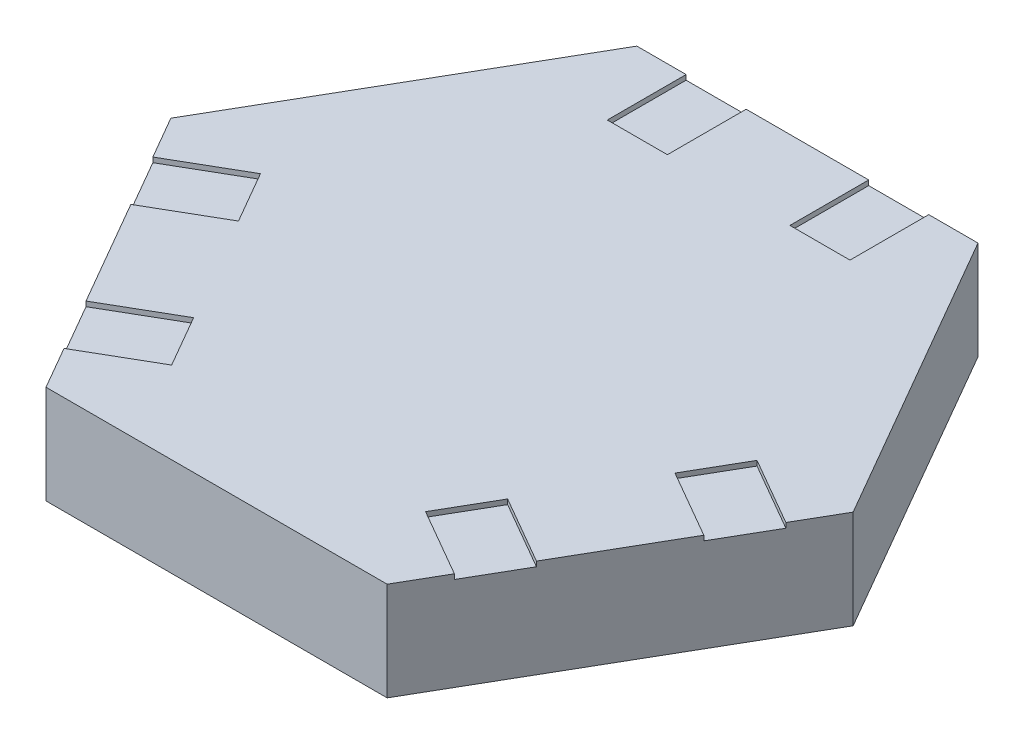
ISO-10303-21;
HEADER;
FILE_DESCRIPTION(('STEP AP214'),'2;1');
FILE_NAME('part.step','',(''),(''),'','','');
FILE_SCHEMA(('AUTOMOTIVE_DESIGN { 1 0 10303 214 1 1 1 1 }'));
ENDSEC;
DATA;
#1=APPLICATION_CONTEXT('core data for automotive mechanical design processes');
#2=APPLICATION_PROTOCOL_DEFINITION('international standard','automotive_design',2000,#1);
#3=PRODUCT_CONTEXT('',#1,'mechanical');
#4=PRODUCT('Part','Part','',(#3));
#5=PRODUCT_RELATED_PRODUCT_CATEGORY('part','',(#4));
#6=PRODUCT_DEFINITION_FORMATION('','',#4);
#7=PRODUCT_DEFINITION_CONTEXT('part definition',#1,'design');
#8=PRODUCT_DEFINITION('design','',#6,#7);
#9=PRODUCT_DEFINITION_SHAPE('','',#8);
#10=(LENGTH_UNIT() NAMED_UNIT(*) SI_UNIT(.MILLI.,.METRE.));
#11=(NAMED_UNIT(*) PLANE_ANGLE_UNIT() SI_UNIT($,.RADIAN.));
#12=(NAMED_UNIT(*) SI_UNIT($,.STERADIAN.) SOLID_ANGLE_UNIT());
#13=UNCERTAINTY_MEASURE_WITH_UNIT(LENGTH_MEASURE(1.E-05),#10,'distance_accuracy_value','');
#14=(GEOMETRIC_REPRESENTATION_CONTEXT(3) GLOBAL_UNCERTAINTY_ASSIGNED_CONTEXT((#13)) GLOBAL_UNIT_ASSIGNED_CONTEXT((#10,
#11,#12)) REPRESENTATION_CONTEXT('',''));
#15=CARTESIAN_POINT('',(0.,0.,0.));
#16=DIRECTION('',(0.,0.,1.));
#17=DIRECTION('',(1.,0.,0.));
#18=AXIS2_PLACEMENT_3D('',#15,#16,#17);
#19=CARTESIAN_POINT('',(34.6410161513775,20.,60.));
#20=DIRECTION('',(-0.866025403784439,0.,-0.5));
#21=DIRECTION('',(-0.5,0.,0.866025403784439));
#22=AXIS2_PLACEMENT_3D('',#19,#20,#21);
#23=PLANE('',#22);
#24=DIRECTION('',(0.5,0.,-0.866025403784439));
#25=VECTOR('',#24,1.);
#26=CARTESIAN_POINT('',(64.2820323027575,19.,8.66025403784195));
#27=LINE('',#26,#25);
#28=CARTESIAN_POINT('',(58.1820323027575,19.,19.2257639640121));
#29=VERTEX_POINT('',#28);
#30=CARTESIAN_POINT('',(64.2820323027575,19.,8.66025403784195));
#31=VERTEX_POINT('',#30);
#32=EDGE_CURVE('E314',#29,#31,#27,.T.);
#33=ORIENTED_EDGE('',*,*,#32,.F.);
#34=DIRECTION('',(0.,1.,0.));
#35=VECTOR('',#34,1.);
#36=CARTESIAN_POINT('',(58.1820323027575,19.,19.2257639640121));
#37=LINE('',#36,#35);
#38=CARTESIAN_POINT('',(58.1820323027575,20.,19.2257639640121));
#39=VERTEX_POINT('',#38);
#40=EDGE_CURVE('E295',#29,#39,#37,.T.);
#41=ORIENTED_EDGE('',*,*,#40,.T.);
#42=DIRECTION('',(0.5,0.,-0.866025403784439));
#43=VECTOR('',#42,1.);
#44=CARTESIAN_POINT('',(34.6410161513775,20.,60.));
#45=LINE('',#44,#43);
#46=CARTESIAN_POINT('',(45.7410161513792,20.,40.7742360359826));
#47=VERTEX_POINT('',#46);
#48=EDGE_CURVE('E476',#47,#39,#45,.T.);
#49=ORIENTED_EDGE('',*,*,#48,.F.);
#50=DIRECTION('',(0.,1.,0.));
#51=VECTOR('',#50,1.);
#52=CARTESIAN_POINT('',(45.74101615138,19.,40.774236035983));
#53=LINE('',#52,#51);
#54=CARTESIAN_POINT('',(45.74101615138,19.,40.774236035983));
#55=VERTEX_POINT('',#54);
#56=EDGE_CURVE('E371',#55,#47,#53,.T.);
#57=ORIENTED_EDGE('',*,*,#56,.F.);
#58=DIRECTION('',(0.499999999999999,0.,-0.866025403784439));
#59=VECTOR('',#58,1.);
#60=CARTESIAN_POINT('',(45.74101615138,19.,40.774236035983));
#61=LINE('',#60,#59);
#62=CARTESIAN_POINT('',(39.64101615138,19.,51.3397459621532));
#63=VERTEX_POINT('',#62);
#64=EDGE_CURVE('E354',#63,#55,#61,.T.);
#65=ORIENTED_EDGE('',*,*,#64,.F.);
#66=DIRECTION('',(0.,1.,0.));
#67=VECTOR('',#66,1.);
#68=CARTESIAN_POINT('',(39.64101615138,19.,51.3397459621532));
#69=LINE('',#68,#67);
#70=CARTESIAN_POINT('',(39.64101615138,20.,51.3397459621532));
#71=VERTEX_POINT('',#70);
#72=EDGE_CURVE('E337',#63,#71,#69,.T.);
#73=ORIENTED_EDGE('',*,*,#72,.T.);
#74=CARTESIAN_POINT('',(34.6410161513775,20.,60.));
#75=VERTEX_POINT('',#74);
#76=EDGE_CURVE('E471',#75,#71,#45,.T.);
#77=ORIENTED_EDGE('',*,*,#76,.F.);
#78=DIRECTION('',(0.,-1.,0.));
#79=VECTOR('',#78,1.);
#80=CARTESIAN_POINT('',(34.6410161513775,20.,60.));
#81=LINE('',#80,#79);
#82=CARTESIAN_POINT('',(34.6410161513775,0.,60.));
#83=VERTEX_POINT('',#82);
#84=EDGE_CURVE('E497',#75,#83,#81,.T.);
#85=ORIENTED_EDGE('',*,*,#84,.T.);
#86=DIRECTION('',(0.5,0.,-0.866025403784439));
#87=VECTOR('',#86,1.);
#88=CARTESIAN_POINT('',(34.6410161513775,0.,60.));
#89=LINE('',#88,#87);
#90=CARTESIAN_POINT('',(69.2820323027551,0.,0.));
#91=VERTEX_POINT('',#90);
#92=EDGE_CURVE('E462',#83,#91,#89,.T.);
#93=ORIENTED_EDGE('',*,*,#92,.T.);
#94=DIRECTION('',(0.,-1.,0.));
#95=VECTOR('',#94,1.);
#96=CARTESIAN_POINT('',(69.2820323027551,20.,0.));
#97=LINE('',#96,#95);
#98=CARTESIAN_POINT('',(69.2820323027551,20.,0.));
#99=VERTEX_POINT('',#98);
#100=EDGE_CURVE('E11',#99,#91,#97,.T.);
#101=ORIENTED_EDGE('',*,*,#100,.F.);
#102=CARTESIAN_POINT('',(64.2820323027567,20.,8.66025403784151));
#103=VERTEX_POINT('',#102);
#104=EDGE_CURVE('E477',#103,#99,#45,.T.);
#105=ORIENTED_EDGE('',*,*,#104,.F.);
#106=DIRECTION('',(0.,1.,0.));
#107=VECTOR('',#106,1.);
#108=CARTESIAN_POINT('',(64.2820323027575,19.,8.66025403784195));
#109=LINE('',#108,#107);
#110=EDGE_CURVE('E331',#31,#103,#109,.T.);
#111=ORIENTED_EDGE('',*,*,#110,.F.);
#112=EDGE_LOOP('',(#33,#41,#49,#57,#65,#73,#77,#85,#93,#101,#105,#111));
#113=FACE_BOUND('',#112,.T.);
#114=ADVANCED_FACE('F39',(#113),#23,.F.);
#115=CARTESIAN_POINT('',(69.2820323027551,20.,0.));
#116=DIRECTION('',(-0.866025403784439,0.,0.5));
#117=DIRECTION('',(0.5,0.,0.866025403784439));
#118=AXIS2_PLACEMENT_3D('',#115,#116,#117);
#119=PLANE('',#118);
#120=DIRECTION('',(-0.5,0.,-0.866025403784439));
#121=VECTOR('',#120,1.);
#122=CARTESIAN_POINT('',(69.2820323027551,0.,0.));
#123=LINE('',#122,#121);
#124=CARTESIAN_POINT('',(34.6410161513775,0.,-60.0000000000001));
#125=VERTEX_POINT('',#124);
#126=EDGE_CURVE('E501',#91,#125,#123,.T.);
#127=ORIENTED_EDGE('',*,*,#126,.T.);
#128=DIRECTION('',(0.,-1.,0.));
#129=VECTOR('',#128,1.);
#130=CARTESIAN_POINT('',(34.6410161513775,20.,-60.0000000000001));
#131=LINE('',#130,#129);
#132=CARTESIAN_POINT('',(34.6410161513775,20.,-60.0000000000001));
#133=VERTEX_POINT('',#132);
#134=EDGE_CURVE('E47',#133,#125,#131,.T.);
#135=ORIENTED_EDGE('',*,*,#134,.F.);
#136=DIRECTION('',(-0.5,0.,-0.866025403784439));
#137=VECTOR('',#136,1.);
#138=CARTESIAN_POINT('',(69.2820323027551,20.,0.));
#139=LINE('',#138,#137);
#140=EDGE_CURVE('E475',#99,#133,#139,.T.);
#141=ORIENTED_EDGE('',*,*,#140,.F.);
#142=ORIENTED_EDGE('',*,*,#100,.T.);
#143=EDGE_LOOP('',(#127,#135,#141,#142));
#144=FACE_BOUND('',#143,.T.);
#145=ADVANCED_FACE('F592',(#144),#119,.F.);
#146=CARTESIAN_POINT('',(34.6410161513775,20.,-60.0000000000001));
#147=DIRECTION('',(0.,0.,1.));
#148=DIRECTION('',(1.,0.,0.));
#149=AXIS2_PLACEMENT_3D('',#146,#147,#148);
#150=PLANE('',#149);
#151=DIRECTION('',(-1.,0.,0.));
#152=VECTOR('',#151,1.);
#153=CARTESIAN_POINT('',(12.4410161513775,19.,-60.0000000000001));
#154=LINE('',#153,#152);
#155=CARTESIAN_POINT('',(24.6410161513775,19.,-60.0000000000001));
#156=VERTEX_POINT('',#155);
#157=CARTESIAN_POINT('',(12.4410161513775,19.,-60.0000000000001));
#158=VERTEX_POINT('',#157);
#159=EDGE_CURVE('E272',#156,#158,#154,.T.);
#160=ORIENTED_EDGE('',*,*,#159,.F.);
#161=DIRECTION('',(0.,1.,0.));
#162=VECTOR('',#161,1.);
#163=CARTESIAN_POINT('',(24.6410161513775,19.,-60.0000000000001));
#164=LINE('',#163,#162);
#165=CARTESIAN_POINT('',(24.6410161513775,20.,-60.0000000000001));
#166=VERTEX_POINT('',#165);
#167=EDGE_CURVE('E301',#156,#166,#164,.T.);
#168=ORIENTED_EDGE('',*,*,#167,.T.);
#169=DIRECTION('',(-1.,0.,0.));
#170=VECTOR('',#169,1.);
#171=CARTESIAN_POINT('',(34.6410161513775,20.,-60.0000000000001));
#172=LINE('',#171,#170);
#173=EDGE_CURVE('E481',#133,#166,#172,.T.);
#174=ORIENTED_EDGE('',*,*,#173,.F.);
#175=ORIENTED_EDGE('',*,*,#134,.T.);
#176=DIRECTION('',(-1.,0.,0.));
#177=VECTOR('',#176,1.);
#178=CARTESIAN_POINT('',(34.6410161513775,0.,-60.0000000000001));
#179=LINE('',#178,#177);
#180=CARTESIAN_POINT('',(-34.6410161513776,0.,-60.0000000000001));
#181=VERTEX_POINT('',#180);
#182=EDGE_CURVE('E504',#125,#181,#179,.T.);
#183=ORIENTED_EDGE('',*,*,#182,.T.);
#184=DIRECTION('',(0.,-1.,0.));
#185=VECTOR('',#184,1.);
#186=CARTESIAN_POINT('',(-34.6410161513776,20.,-60.0000000000001));
#187=LINE('',#186,#185);
#188=CARTESIAN_POINT('',(-34.6410161513776,20.,-60.0000000000001));
#189=VERTEX_POINT('',#188);
#190=EDGE_CURVE('E527',#189,#181,#187,.T.);
#191=ORIENTED_EDGE('',*,*,#190,.F.);
#192=CARTESIAN_POINT('',(-24.6410161513776,20.,-60.0000000000001));
#193=VERTEX_POINT('',#192);
#194=EDGE_CURVE('E480',#193,#189,#172,.T.);
#195=ORIENTED_EDGE('',*,*,#194,.F.);
#196=DIRECTION('',(0.,1.,0.));
#197=VECTOR('',#196,1.);
#198=CARTESIAN_POINT('',(-24.6410161513776,19.,-60.));
#199=LINE('',#198,#197);
#200=CARTESIAN_POINT('',(-24.6410161513776,19.,-60.));
#201=VERTEX_POINT('',#200);
#202=EDGE_CURVE('E448',#201,#193,#199,.T.);
#203=ORIENTED_EDGE('',*,*,#202,.F.);
#204=DIRECTION('',(-1.,0.,0.));
#205=VECTOR('',#204,1.);
#206=CARTESIAN_POINT('',(-24.6410161513776,19.,-60.));
#207=LINE('',#206,#205);
#208=CARTESIAN_POINT('',(-12.4410161513776,19.,-60.0000000000001));
#209=VERTEX_POINT('',#208);
#210=EDGE_CURVE('E431',#209,#201,#207,.T.);
#211=ORIENTED_EDGE('',*,*,#210,.F.);
#212=DIRECTION('',(0.,1.,0.));
#213=VECTOR('',#212,1.);
#214=CARTESIAN_POINT('',(-12.4410161513776,19.,-60.0000000000001));
#215=LINE('',#214,#213);
#216=CARTESIAN_POINT('',(-12.4410161513776,20.,-60.0000000000001));
#217=VERTEX_POINT('',#216);
#218=EDGE_CURVE('E458',#209,#217,#215,.T.);
#219=ORIENTED_EDGE('',*,*,#218,.T.);
#220=CARTESIAN_POINT('',(12.4410161513775,20.,-60.0000000000001));
#221=VERTEX_POINT('',#220);
#222=EDGE_CURVE('E486',#221,#217,#172,.T.);
#223=ORIENTED_EDGE('',*,*,#222,.F.);
#224=DIRECTION('',(0.,1.,0.));
#225=VECTOR('',#224,1.);
#226=CARTESIAN_POINT('',(12.4410161513775,19.,-60.0000000000001));
#227=LINE('',#226,#225);
#228=EDGE_CURVE('E289',#158,#221,#227,.T.);
#229=ORIENTED_EDGE('',*,*,#228,.F.);
#230=EDGE_LOOP('',(#160,#168,#174,#175,#183,#191,#195,#203,#211,#219,#223,#229));
#231=FACE_BOUND('',#230,.T.);
#232=ADVANCED_FACE('F537',(#231),#150,.F.);
#233=CARTESIAN_POINT('',(-34.6410161513776,20.,-60.0000000000001));
#234=DIRECTION('',(0.866025403784439,0.,0.5));
#235=DIRECTION('',(0.5,0.,-0.866025403784439));
#236=AXIS2_PLACEMENT_3D('',#233,#234,#235);
#237=PLANE('',#236);
#238=DIRECTION('',(-0.5,0.,0.866025403784439));
#239=VECTOR('',#238,1.);
#240=CARTESIAN_POINT('',(-34.6410161513776,0.,-60.0000000000001));
#241=LINE('',#240,#239);
#242=CARTESIAN_POINT('',(-69.2820323027551,0.,0.));
#243=VERTEX_POINT('',#242);
#244=EDGE_CURVE('E507',#181,#243,#241,.T.);
#245=ORIENTED_EDGE('',*,*,#244,.T.);
#246=DIRECTION('',(0.,-1.,0.));
#247=VECTOR('',#246,1.);
#248=CARTESIAN_POINT('',(-69.2820323027551,20.,0.));
#249=LINE('',#248,#247);
#250=CARTESIAN_POINT('',(-69.2820323027551,20.,0.));
#251=VERTEX_POINT('',#250);
#252=EDGE_CURVE('E523',#251,#243,#249,.T.);
#253=ORIENTED_EDGE('',*,*,#252,.F.);
#254=DIRECTION('',(-0.5,0.,0.866025403784439));
#255=VECTOR('',#254,1.);
#256=CARTESIAN_POINT('',(-34.6410161513776,20.,-60.0000000000001));
#257=LINE('',#256,#255);
#258=EDGE_CURVE('E485',#189,#251,#257,.T.);
#259=ORIENTED_EDGE('',*,*,#258,.F.);
#260=ORIENTED_EDGE('',*,*,#190,.T.);
#261=EDGE_LOOP('',(#245,#253,#259,#260));
#262=FACE_BOUND('',#261,.T.);
#263=ADVANCED_FACE('F549',(#262),#237,.F.);
#264=CARTESIAN_POINT('',(-69.2820323027551,20.,0.));
#265=DIRECTION('',(0.866025403784439,0.,-0.5));
#266=DIRECTION('',(-0.5,0.,-0.866025403784439));
#267=AXIS2_PLACEMENT_3D('',#264,#265,#266);
#268=PLANE('',#267);
#269=DIRECTION('',(0.5,0.,0.866025403784438));
#270=VECTOR('',#269,1.);
#271=CARTESIAN_POINT('',(-45.7410161513743,19.,40.7742360359864));
#272=LINE('',#271,#270);
#273=CARTESIAN_POINT('',(-45.7410161513743,19.,40.7742360359864));
#274=VERTEX_POINT('',#273);
#275=CARTESIAN_POINT('',(-39.6410161513743,19.,51.3397459621565));
#276=VERTEX_POINT('',#275);
#277=EDGE_CURVE('E394',#274,#276,#272,.T.);
#278=ORIENTED_EDGE('',*,*,#277,.F.);
#279=DIRECTION('',(0.,1.,0.));
#280=VECTOR('',#279,1.);
#281=CARTESIAN_POINT('',(-45.7410161513743,19.,40.7742360359864));
#282=LINE('',#281,#280);
#283=CARTESIAN_POINT('',(-45.7410161513743,20.,40.7742360359864));
#284=VERTEX_POINT('',#283);
#285=EDGE_CURVE('E377',#274,#284,#282,.T.);
#286=ORIENTED_EDGE('',*,*,#285,.T.);
#287=DIRECTION('',(0.5,0.,0.866025403784439));
#288=VECTOR('',#287,1.);
#289=CARTESIAN_POINT('',(-69.2820323027551,20.,0.));
#290=LINE('',#289,#288);
#291=CARTESIAN_POINT('',(-58.1820323027539,20.,19.2257639640166));
#292=VERTEX_POINT('',#291);
#293=EDGE_CURVE('E262',#292,#284,#290,.T.);
#294=ORIENTED_EDGE('',*,*,#293,.F.);
#295=DIRECTION('',(0.,1.,0.));
#296=VECTOR('',#295,1.);
#297=CARTESIAN_POINT('',(-58.1820323027518,19.,19.2257639640155));
#298=LINE('',#297,#296);
#299=CARTESIAN_POINT('',(-58.1820323027518,19.,19.2257639640155));
#300=VERTEX_POINT('',#299);
#301=EDGE_CURVE('E62',#300,#292,#298,.T.);
#302=ORIENTED_EDGE('',*,*,#301,.F.);
#303=DIRECTION('',(0.499999999999999,0.,0.866025403784439));
#304=VECTOR('',#303,1.);
#305=CARTESIAN_POINT('',(-64.2820323027518,19.,8.66025403784531));
#306=LINE('',#305,#304);
#307=CARTESIAN_POINT('',(-64.2820323027518,19.,8.66025403784531));
#308=VERTEX_POINT('',#307);
#309=EDGE_CURVE('E245',#308,#300,#306,.T.);
#310=ORIENTED_EDGE('',*,*,#309,.F.);
#311=DIRECTION('',(0.,1.,0.));
#312=VECTOR('',#311,1.);
#313=CARTESIAN_POINT('',(-64.2820323027518,19.,8.66025403784531));
#314=LINE('',#313,#312);
#315=CARTESIAN_POINT('',(-64.2820323027518,20.,8.66025403784531));
#316=VERTEX_POINT('',#315);
#317=EDGE_CURVE('E415',#308,#316,#314,.T.);
#318=ORIENTED_EDGE('',*,*,#317,.T.);
#319=EDGE_CURVE('E490',#251,#316,#290,.T.);
#320=ORIENTED_EDGE('',*,*,#319,.F.);
#321=ORIENTED_EDGE('',*,*,#252,.T.);
#322=DIRECTION('',(0.5,0.,0.866025403784439));
#323=VECTOR('',#322,1.);
#324=CARTESIAN_POINT('',(-69.2820323027551,0.,0.));
#325=LINE('',#324,#323);
#326=CARTESIAN_POINT('',(-34.6410161513776,0.,60.));
#327=VERTEX_POINT('',#326);
#328=EDGE_CURVE('E510',#243,#327,#325,.T.);
#329=ORIENTED_EDGE('',*,*,#328,.T.);
#330=DIRECTION('',(0.,-1.,0.));
#331=VECTOR('',#330,1.);
#332=CARTESIAN_POINT('',(-34.6410161513776,20.,60.));
#333=LINE('',#332,#331);
#334=CARTESIAN_POINT('',(-34.6410161513776,20.,60.));
#335=VERTEX_POINT('',#334);
#336=EDGE_CURVE('E519',#335,#327,#333,.T.);
#337=ORIENTED_EDGE('',*,*,#336,.F.);
#338=CARTESIAN_POINT('',(-39.6410161513764,20.,51.3397459621577));
#339=VERTEX_POINT('',#338);
#340=EDGE_CURVE('E489',#339,#335,#290,.T.);
#341=ORIENTED_EDGE('',*,*,#340,.F.);
#342=DIRECTION('',(0.,1.,0.));
#343=VECTOR('',#342,1.);
#344=CARTESIAN_POINT('',(-39.6410161513743,19.,51.3397459621565));
#345=LINE('',#344,#343);
#346=EDGE_CURVE('E54',#276,#339,#345,.T.);
#347=ORIENTED_EDGE('',*,*,#346,.F.);
#348=EDGE_LOOP('',(#278,#286,#294,#302,#310,#318,#320,#321,#329,#337,#341,#347));
#349=FACE_BOUND('',#348,.T.);
#350=ADVANCED_FACE('F259',(#349),#268,.F.);
#351=CARTESIAN_POINT('',(-34.6410161513776,20.,60.));
#352=DIRECTION('',(0.,0.,-1.));
#353=DIRECTION('',(-1.,0.,0.));
#354=AXIS2_PLACEMENT_3D('',#351,#352,#353);
#355=PLANE('',#354);
#356=DIRECTION('',(1.,0.,0.));
#357=VECTOR('',#356,1.);
#358=CARTESIAN_POINT('',(-34.6410161513776,0.,60.));
#359=LINE('',#358,#357);
#360=EDGE_CURVE('E513',#327,#83,#359,.T.);
#361=ORIENTED_EDGE('',*,*,#360,.T.);
#362=ORIENTED_EDGE('',*,*,#84,.F.);
#363=DIRECTION('',(1.,0.,0.));
#364=VECTOR('',#363,1.);
#365=CARTESIAN_POINT('',(-34.6410161513776,20.,60.));
#366=LINE('',#365,#364);
#367=EDGE_CURVE('E494',#335,#75,#366,.T.);
#368=ORIENTED_EDGE('',*,*,#367,.F.);
#369=ORIENTED_EDGE('',*,*,#336,.T.);
#370=EDGE_LOOP('',(#361,#362,#368,#369));
#371=FACE_BOUND('',#370,.T.);
#372=ADVANCED_FACE('F620',(#371),#355,.F.);
#373=CARTESIAN_POINT('',(0.,20.,0.));
#374=DIRECTION('',(0.,1.,0.));
#375=DIRECTION('',(0.,0.,1.));
#376=AXIS2_PLACEMENT_3D('',#373,#374,#375);
#377=PLANE('',#376);
#378=DIRECTION('',(0.,0.,-1.));
#379=VECTOR('',#378,1.);
#380=CARTESIAN_POINT('',(24.6410161513775,20.,-44.));
#381=LINE('',#380,#379);
#382=CARTESIAN_POINT('',(24.6410161513775,20.,-44.));
#383=VERTEX_POINT('',#382);
#384=EDGE_CURVE('E277',#383,#166,#381,.T.);
#385=ORIENTED_EDGE('',*,*,#384,.F.);
#386=DIRECTION('',(1.,0.,0.));
#387=VECTOR('',#386,1.);
#388=CARTESIAN_POINT('',(12.4410161513775,20.,-44.));
#389=LINE('',#388,#387);
#390=CARTESIAN_POINT('',(12.4410161513775,20.,-44.));
#391=VERTEX_POINT('',#390);
#392=EDGE_CURVE('E294',#391,#383,#389,.T.);
#393=ORIENTED_EDGE('',*,*,#392,.F.);
#394=DIRECTION('',(0.,0.,1.));
#395=VECTOR('',#394,1.);
#396=CARTESIAN_POINT('',(12.4410161513775,20.,-60.0000000000001));
#397=LINE('',#396,#395);
#398=EDGE_CURVE('E290',#221,#391,#397,.T.);
#399=ORIENTED_EDGE('',*,*,#398,.F.);
#400=ORIENTED_EDGE('',*,*,#222,.T.);
#401=DIRECTION('',(0.,0.,-1.));
#402=VECTOR('',#401,1.);
#403=CARTESIAN_POINT('',(-12.4410161513776,20.,-44.));
#404=LINE('',#403,#402);
#405=CARTESIAN_POINT('',(-12.4410161513776,20.,-44.));
#406=VERTEX_POINT('',#405);
#407=EDGE_CURVE('E436',#406,#217,#404,.T.);
#408=ORIENTED_EDGE('',*,*,#407,.F.);
#409=DIRECTION('',(1.,0.,0.));
#410=VECTOR('',#409,1.);
#411=CARTESIAN_POINT('',(-24.6410161513776,20.,-44.));
#412=LINE('',#411,#410);
#413=CARTESIAN_POINT('',(-24.6410161513776,20.,-44.));
#414=VERTEX_POINT('',#413);
#415=EDGE_CURVE('E452',#414,#406,#412,.T.);
#416=ORIENTED_EDGE('',*,*,#415,.F.);
#417=DIRECTION('',(0.,0.,1.));
#418=VECTOR('',#417,1.);
#419=CARTESIAN_POINT('',(-24.6410161513776,20.,-60.));
#420=LINE('',#419,#418);
#421=EDGE_CURVE('E305',#193,#414,#420,.T.);
#422=ORIENTED_EDGE('',*,*,#421,.F.);
#423=ORIENTED_EDGE('',*,*,#194,.T.);
#424=ORIENTED_EDGE('',*,*,#258,.T.);
#425=ORIENTED_EDGE('',*,*,#319,.T.);
#426=DIRECTION('',(-0.866025403784438,0.,0.500000000000001));
#427=VECTOR('',#426,1.);
#428=CARTESIAN_POINT('',(-50.4256258422008,20.,0.660254037845296));
#429=LINE('',#428,#427);
#430=CARTESIAN_POINT('',(-50.4256258422008,20.,0.660254037845296));
#431=VERTEX_POINT('',#430);
#432=EDGE_CURVE('E255',#431,#316,#429,.T.);
#433=ORIENTED_EDGE('',*,*,#432,.F.);
#434=DIRECTION('',(-0.5,0.,-0.866025403784438));
#435=VECTOR('',#434,1.);
#436=CARTESIAN_POINT('',(-44.3256258422008,20.,11.2257639640154));
#437=LINE('',#436,#435);
#438=CARTESIAN_POINT('',(-44.3256258422008,20.,11.2257639640154));
#439=VERTEX_POINT('',#438);
#440=EDGE_CURVE('E629',#439,#431,#437,.T.);
#441=ORIENTED_EDGE('',*,*,#440,.F.);
#442=DIRECTION('',(0.866025403784438,0.,-0.500000000000001));
#443=VECTOR('',#442,1.);
#444=CARTESIAN_POINT('',(-58.1820323027518,20.,19.2257639640155));
#445=LINE('',#444,#443);
#446=EDGE_CURVE('E627',#292,#439,#445,.T.);
#447=ORIENTED_EDGE('',*,*,#446,.F.);
#448=ORIENTED_EDGE('',*,*,#293,.T.);
#449=DIRECTION('',(-0.866025403784438,0.,0.5));
#450=VECTOR('',#449,1.);
#451=CARTESIAN_POINT('',(-31.8846096908233,20.,32.7742360359864));
#452=LINE('',#451,#450);
#453=CARTESIAN_POINT('',(-31.8846096908233,20.,32.7742360359864));
#454=VERTEX_POINT('',#453);
#455=EDGE_CURVE('E399',#454,#284,#452,.T.);
#456=ORIENTED_EDGE('',*,*,#455,.F.);
#457=DIRECTION('',(-0.5,0.,-0.866025403784438));
#458=VECTOR('',#457,1.);
#459=CARTESIAN_POINT('',(-25.7846096908233,20.,43.3397459621565));
#460=LINE('',#459,#458);
#461=CARTESIAN_POINT('',(-25.7846096908233,20.,43.3397459621565));
#462=VERTEX_POINT('',#461);
#463=EDGE_CURVE('E414',#462,#454,#460,.T.);
#464=ORIENTED_EDGE('',*,*,#463,.F.);
#465=DIRECTION('',(0.866025403784438,0.,-0.5));
#466=VECTOR('',#465,1.);
#467=CARTESIAN_POINT('',(-39.6410161513743,20.,51.3397459621565));
#468=LINE('',#467,#466);
#469=EDGE_CURVE('E411',#339,#462,#468,.T.);
#470=ORIENTED_EDGE('',*,*,#469,.F.);
#471=ORIENTED_EDGE('',*,*,#340,.T.);
#472=ORIENTED_EDGE('',*,*,#367,.T.);
#473=ORIENTED_EDGE('',*,*,#76,.T.);
#474=DIRECTION('',(0.866025403784439,0.,0.5));
#475=VECTOR('',#474,1.);
#476=CARTESIAN_POINT('',(25.784609690829,20.,43.3397459621532));
#477=LINE('',#476,#475);
#478=CARTESIAN_POINT('',(25.784609690829,20.,43.3397459621532));
#479=VERTEX_POINT('',#478);
#480=EDGE_CURVE('E359',#479,#71,#477,.T.);
#481=ORIENTED_EDGE('',*,*,#480,.F.);
#482=DIRECTION('',(-0.5,0.,0.866025403784439));
#483=VECTOR('',#482,1.);
#484=CARTESIAN_POINT('',(31.884609690829,20.,32.7742360359831));
#485=LINE('',#484,#483);
#486=CARTESIAN_POINT('',(31.884609690829,20.,32.7742360359831));
#487=VERTEX_POINT('',#486);
#488=EDGE_CURVE('E376',#487,#479,#485,.T.);
#489=ORIENTED_EDGE('',*,*,#488,.F.);
#490=DIRECTION('',(-0.866025403784439,0.,-0.5));
#491=VECTOR('',#490,1.);
#492=CARTESIAN_POINT('',(45.74101615138,20.,40.774236035983));
#493=LINE('',#492,#491);
#494=EDGE_CURVE('E372',#47,#487,#493,.T.);
#495=ORIENTED_EDGE('',*,*,#494,.F.);
#496=ORIENTED_EDGE('',*,*,#48,.T.);
#497=DIRECTION('',(0.866025403784439,0.,0.5));
#498=VECTOR('',#497,1.);
#499=CARTESIAN_POINT('',(44.3256258422065,20.,11.2257639640121));
#500=LINE('',#499,#498);
#501=CARTESIAN_POINT('',(44.3256258422065,20.,11.2257639640121));
#502=VERTEX_POINT('',#501);
#503=EDGE_CURVE('E319',#502,#39,#500,.T.);
#504=ORIENTED_EDGE('',*,*,#503,.F.);
#505=DIRECTION('',(-0.5,0.,0.866025403784439));
#506=VECTOR('',#505,1.);
#507=CARTESIAN_POINT('',(50.4256258422065,20.,0.660254037841961));
#508=LINE('',#507,#506);
#509=CARTESIAN_POINT('',(50.4256258422065,20.,0.660254037841961));
#510=VERTEX_POINT('',#509);
#511=EDGE_CURVE('E336',#510,#502,#508,.T.);
#512=ORIENTED_EDGE('',*,*,#511,.F.);
#513=DIRECTION('',(-0.866025403784439,0.,-0.5));
#514=VECTOR('',#513,1.);
#515=CARTESIAN_POINT('',(64.2820323027575,20.,8.66025403784195));
#516=LINE('',#515,#514);
#517=EDGE_CURVE('E332',#103,#510,#516,.T.);
#518=ORIENTED_EDGE('',*,*,#517,.F.);
#519=ORIENTED_EDGE('',*,*,#104,.T.);
#520=ORIENTED_EDGE('',*,*,#140,.T.);
#521=ORIENTED_EDGE('',*,*,#173,.T.);
#522=EDGE_LOOP('',(#385,#393,#399,#400,#408,#416,#422,#423,#424,#425,#433,#441,#447,#448,#456,
#464,#470,#471,#472,#473,#481,#489,#495,#496,#504,#512,#518,#519,#520,#521));
#523=FACE_BOUND('',#522,.T.);
#524=ADVANCED_FACE('F556',(#523),#377,.T.);
#525=CARTESIAN_POINT('',(0.,0.,0.));
#526=DIRECTION('',(0.,1.,0.));
#527=DIRECTION('',(0.,0.,1.));
#528=AXIS2_PLACEMENT_3D('',#525,#526,#527);
#529=PLANE('',#528);
#530=ORIENTED_EDGE('',*,*,#92,.F.);
#531=ORIENTED_EDGE('',*,*,#360,.F.);
#532=ORIENTED_EDGE('',*,*,#328,.F.);
#533=ORIENTED_EDGE('',*,*,#244,.F.);
#534=ORIENTED_EDGE('',*,*,#182,.F.);
#535=ORIENTED_EDGE('',*,*,#126,.F.);
#536=EDGE_LOOP('',(#530,#531,#532,#533,#534,#535));
#537=FACE_BOUND('',#536,.T.);
#538=ADVANCED_FACE('F544',(#537),#529,.F.);
#539=CARTESIAN_POINT('',(-12.4410161513776,19.,-44.));
#540=DIRECTION('',(1.,0.,0.));
#541=DIRECTION('',(0.,0.,-1.));
#542=AXIS2_PLACEMENT_3D('',#539,#540,#541);
#543=PLANE('',#542);
#544=ORIENTED_EDGE('',*,*,#407,.T.);
#545=ORIENTED_EDGE('',*,*,#218,.F.);
#546=DIRECTION('',(0.,0.,-1.));
#547=VECTOR('',#546,1.);
#548=CARTESIAN_POINT('',(-12.4410161513776,19.,-44.));
#549=LINE('',#548,#547);
#550=CARTESIAN_POINT('',(-12.4410161513776,19.,-44.));
#551=VERTEX_POINT('',#550);
#552=EDGE_CURVE('E444',#551,#209,#549,.T.);
#553=ORIENTED_EDGE('',*,*,#552,.F.);
#554=DIRECTION('',(0.,1.,0.));
#555=VECTOR('',#554,1.);
#556=CARTESIAN_POINT('',(-12.4410161513776,19.,-44.));
#557=LINE('',#556,#555);
#558=EDGE_CURVE('E463',#551,#406,#557,.T.);
#559=ORIENTED_EDGE('',*,*,#558,.T.);
#560=EDGE_LOOP('',(#544,#545,#553,#559));
#561=FACE_BOUND('',#560,.T.);
#562=ADVANCED_FACE('F573',(#561),#543,.F.);
#563=CARTESIAN_POINT('',(-24.6410161513776,19.,-44.));
#564=DIRECTION('',(0.,0.,1.));
#565=DIRECTION('',(1.,0.,0.));
#566=AXIS2_PLACEMENT_3D('',#563,#564,#565);
#567=PLANE('',#566);
#568=ORIENTED_EDGE('',*,*,#415,.T.);
#569=ORIENTED_EDGE('',*,*,#558,.F.);
#570=DIRECTION('',(1.,0.,0.));
#571=VECTOR('',#570,1.);
#572=CARTESIAN_POINT('',(-24.6410161513776,19.,-44.));
#573=LINE('',#572,#571);
#574=CARTESIAN_POINT('',(-24.6410161513776,19.,-44.));
#575=VERTEX_POINT('',#574);
#576=EDGE_CURVE('E440',#575,#551,#573,.T.);
#577=ORIENTED_EDGE('',*,*,#576,.F.);
#578=DIRECTION('',(0.,1.,0.));
#579=VECTOR('',#578,1.);
#580=CARTESIAN_POINT('',(-24.6410161513776,19.,-44.));
#581=LINE('',#580,#579);
#582=EDGE_CURVE('E466',#575,#414,#581,.T.);
#583=ORIENTED_EDGE('',*,*,#582,.T.);
#584=EDGE_LOOP('',(#568,#569,#577,#583));
#585=FACE_BOUND('',#584,.T.);
#586=ADVANCED_FACE('F578',(#585),#567,.F.);
#587=CARTESIAN_POINT('',(-24.6410161513776,19.,-60.));
#588=DIRECTION('',(-1.,0.,0.));
#589=DIRECTION('',(0.,0.,1.));
#590=AXIS2_PLACEMENT_3D('',#587,#588,#589);
#591=PLANE('',#590);
#592=ORIENTED_EDGE('',*,*,#421,.T.);
#593=ORIENTED_EDGE('',*,*,#582,.F.);
#594=DIRECTION('',(0.,0.,1.));
#595=VECTOR('',#594,1.);
#596=CARTESIAN_POINT('',(-24.6410161513776,19.,-60.));
#597=LINE('',#596,#595);
#598=EDGE_CURVE('E435',#201,#575,#597,.T.);
#599=ORIENTED_EDGE('',*,*,#598,.F.);
#600=ORIENTED_EDGE('',*,*,#202,.T.);
#601=EDGE_LOOP('',(#592,#593,#599,#600));
#602=FACE_BOUND('',#601,.T.);
#603=ADVANCED_FACE('F580',(#602),#591,.F.);
#604=CARTESIAN_POINT('',(0.,19.,0.));
#605=DIRECTION('',(0.,1.,0.));
#606=DIRECTION('',(0.,0.,1.));
#607=AXIS2_PLACEMENT_3D('',#604,#605,#606);
#608=PLANE('',#607);
#609=ORIENTED_EDGE('',*,*,#210,.T.);
#610=ORIENTED_EDGE('',*,*,#598,.T.);
#611=ORIENTED_EDGE('',*,*,#576,.T.);
#612=ORIENTED_EDGE('',*,*,#552,.T.);
#613=EDGE_LOOP('',(#609,#610,#611,#612));
#614=FACE_BOUND('',#613,.T.);
#615=ADVANCED_FACE('F575',(#614),#608,.T.);
#616=CARTESIAN_POINT('',(-50.4256258422008,19.,0.660254037845296));
#617=DIRECTION('',(-0.500000000000001,0.,-0.866025403784438));
#618=DIRECTION('',(-0.866025403784438,0.,0.500000000000001));
#619=AXIS2_PLACEMENT_3D('',#616,#617,#618);
#620=PLANE('',#619);
#621=ORIENTED_EDGE('',*,*,#432,.T.);
#622=ORIENTED_EDGE('',*,*,#317,.F.);
#623=DIRECTION('',(-0.866025403784438,0.,0.500000000000001));
#624=VECTOR('',#623,1.);
#625=CARTESIAN_POINT('',(-50.4256258422008,19.,0.660254037845296));
#626=LINE('',#625,#624);
#627=CARTESIAN_POINT('',(-50.4256258422008,19.,0.660254037845296));
#628=VERTEX_POINT('',#627);
#629=EDGE_CURVE('E251',#628,#308,#626,.T.);
#630=ORIENTED_EDGE('',*,*,#629,.F.);
#631=DIRECTION('',(0.,1.,0.));
#632=VECTOR('',#631,1.);
#633=CARTESIAN_POINT('',(-50.4256258422008,19.,0.660254037845296));
#634=LINE('',#633,#632);
#635=EDGE_CURVE('E267',#628,#431,#634,.T.);
#636=ORIENTED_EDGE('',*,*,#635,.T.);
#637=EDGE_LOOP('',(#621,#622,#630,#636));
#638=FACE_BOUND('',#637,.T.);
#639=ADVANCED_FACE('F587',(#638),#620,.F.);
#640=CARTESIAN_POINT('',(-44.3256258422008,19.,11.2257639640154));
#641=DIRECTION('',(0.866025403784439,0.,-0.5));
#642=DIRECTION('',(-0.5,0.,-0.866025403784439));
#643=AXIS2_PLACEMENT_3D('',#640,#641,#642);
#644=PLANE('',#643);
#645=ORIENTED_EDGE('',*,*,#440,.T.);
#646=ORIENTED_EDGE('',*,*,#635,.F.);
#647=DIRECTION('',(-0.5,0.,-0.866025403784438));
#648=VECTOR('',#647,1.);
#649=CARTESIAN_POINT('',(-44.3256258422008,19.,11.2257639640154));
#650=LINE('',#649,#648);
#651=CARTESIAN_POINT('',(-44.3256258422008,19.,11.2257639640154));
#652=VERTEX_POINT('',#651);
#653=EDGE_CURVE('E244',#652,#628,#650,.T.);
#654=ORIENTED_EDGE('',*,*,#653,.F.);
#655=DIRECTION('',(0.,1.,0.));
#656=VECTOR('',#655,1.);
#657=CARTESIAN_POINT('',(-44.3256258422008,19.,11.2257639640154));
#658=LINE('',#657,#656);
#659=EDGE_CURVE('E239',#652,#439,#658,.T.);
#660=ORIENTED_EDGE('',*,*,#659,.T.);
#661=EDGE_LOOP('',(#645,#646,#654,#660));
#662=FACE_BOUND('',#661,.T.);
#663=ADVANCED_FACE('F642',(#662),#644,.F.);
#664=CARTESIAN_POINT('',(-58.1820323027518,19.,19.2257639640155));
#665=DIRECTION('',(0.500000000000001,0.,0.866025403784438));
#666=DIRECTION('',(0.866025403784438,0.,-0.500000000000001));
#667=AXIS2_PLACEMENT_3D('',#664,#665,#666);
#668=PLANE('',#667);
#669=ORIENTED_EDGE('',*,*,#446,.T.);
#670=ORIENTED_EDGE('',*,*,#659,.F.);
#671=DIRECTION('',(0.866025403784438,0.,-0.500000000000001));
#672=VECTOR('',#671,1.);
#673=CARTESIAN_POINT('',(-58.1820323027518,19.,19.2257639640155));
#674=LINE('',#673,#672);
#675=EDGE_CURVE('E236',#300,#652,#674,.T.);
#676=ORIENTED_EDGE('',*,*,#675,.F.);
#677=ORIENTED_EDGE('',*,*,#301,.T.);
#678=EDGE_LOOP('',(#669,#670,#676,#677));
#679=FACE_BOUND('',#678,.T.);
#680=ADVANCED_FACE('F238',(#679),#668,.F.);
#681=CARTESIAN_POINT('',(0.,19.,0.));
#682=DIRECTION('',(0.,1.,0.));
#683=DIRECTION('',(0.,0.,1.));
#684=AXIS2_PLACEMENT_3D('',#681,#682,#683);
#685=PLANE('',#684);
#686=ORIENTED_EDGE('',*,*,#309,.T.);
#687=ORIENTED_EDGE('',*,*,#675,.T.);
#688=ORIENTED_EDGE('',*,*,#653,.T.);
#689=ORIENTED_EDGE('',*,*,#629,.T.);
#690=EDGE_LOOP('',(#686,#687,#688,#689));
#691=FACE_BOUND('',#690,.T.);
#692=ADVANCED_FACE('F249',(#691),#685,.T.);
#693=CARTESIAN_POINT('',(-31.8846096908233,19.,32.7742360359864));
#694=DIRECTION('',(-0.5,0.,-0.866025403784438));
#695=DIRECTION('',(-0.866025403784438,0.,0.5));
#696=AXIS2_PLACEMENT_3D('',#693,#694,#695);
#697=PLANE('',#696);
#698=ORIENTED_EDGE('',*,*,#455,.T.);
#699=ORIENTED_EDGE('',*,*,#285,.F.);
#700=DIRECTION('',(-0.866025403784438,0.,0.5));
#701=VECTOR('',#700,1.);
#702=CARTESIAN_POINT('',(-31.8846096908233,19.,32.7742360359864));
#703=LINE('',#702,#701);
#704=CARTESIAN_POINT('',(-31.8846096908233,19.,32.7742360359864));
#705=VERTEX_POINT('',#704);
#706=EDGE_CURVE('E407',#705,#274,#703,.T.);
#707=ORIENTED_EDGE('',*,*,#706,.F.);
#708=DIRECTION('',(0.,1.,0.));
#709=VECTOR('',#708,1.);
#710=CARTESIAN_POINT('',(-31.8846096908233,19.,32.7742360359864));
#711=LINE('',#710,#709);
#712=EDGE_CURVE('E423',#705,#454,#711,.T.);
#713=ORIENTED_EDGE('',*,*,#712,.T.);
#714=EDGE_LOOP('',(#698,#699,#707,#713));
#715=FACE_BOUND('',#714,.T.);
#716=ADVANCED_FACE('F703',(#715),#697,.F.);
#717=CARTESIAN_POINT('',(-25.7846096908233,19.,43.3397459621565));
#718=DIRECTION('',(0.866025403784439,0.,-0.5));
#719=DIRECTION('',(-0.5,0.,-0.866025403784439));
#720=AXIS2_PLACEMENT_3D('',#717,#718,#719);
#721=PLANE('',#720);
#722=ORIENTED_EDGE('',*,*,#463,.T.);
#723=ORIENTED_EDGE('',*,*,#712,.F.);
#724=DIRECTION('',(-0.5,0.,-0.866025403784438));
#725=VECTOR('',#724,1.);
#726=CARTESIAN_POINT('',(-25.7846096908233,19.,43.3397459621565));
#727=LINE('',#726,#725);
#728=CARTESIAN_POINT('',(-25.7846096908233,19.,43.3397459621565));
#729=VERTEX_POINT('',#728);
#730=EDGE_CURVE('E403',#729,#705,#727,.T.);
#731=ORIENTED_EDGE('',*,*,#730,.F.);
#732=DIRECTION('',(0.,1.,0.));
#733=VECTOR('',#732,1.);
#734=CARTESIAN_POINT('',(-25.7846096908233,19.,43.3397459621565));
#735=LINE('',#734,#733);
#736=EDGE_CURVE('E426',#729,#462,#735,.T.);
#737=ORIENTED_EDGE('',*,*,#736,.T.);
#738=EDGE_LOOP('',(#722,#723,#731,#737));
#739=FACE_BOUND('',#738,.T.);
#740=ADVANCED_FACE('F706',(#739),#721,.F.);
#741=CARTESIAN_POINT('',(-39.6410161513743,19.,51.3397459621565));
#742=DIRECTION('',(0.5,0.,0.866025403784438));
#743=DIRECTION('',(0.866025403784438,0.,-0.5));
#744=AXIS2_PLACEMENT_3D('',#741,#742,#743);
#745=PLANE('',#744);
#746=ORIENTED_EDGE('',*,*,#469,.T.);
#747=ORIENTED_EDGE('',*,*,#736,.F.);
#748=DIRECTION('',(0.866025403784438,0.,-0.5));
#749=VECTOR('',#748,1.);
#750=CARTESIAN_POINT('',(-39.6410161513743,19.,51.3397459621565));
#751=LINE('',#750,#749);
#752=EDGE_CURVE('E398',#276,#729,#751,.T.);
#753=ORIENTED_EDGE('',*,*,#752,.F.);
#754=ORIENTED_EDGE('',*,*,#346,.T.);
#755=EDGE_LOOP('',(#746,#747,#753,#754));
#756=FACE_BOUND('',#755,.T.);
#757=ADVANCED_FACE('F701',(#756),#745,.F.);
#758=CARTESIAN_POINT('',(0.,19.,0.));
#759=DIRECTION('',(0.,1.,0.));
#760=DIRECTION('',(0.,0.,1.));
#761=AXIS2_PLACEMENT_3D('',#758,#759,#760);
#762=PLANE('',#761);
#763=ORIENTED_EDGE('',*,*,#277,.T.);
#764=ORIENTED_EDGE('',*,*,#752,.T.);
#765=ORIENTED_EDGE('',*,*,#730,.T.);
#766=ORIENTED_EDGE('',*,*,#706,.T.);
#767=EDGE_LOOP('',(#763,#764,#765,#766));
#768=FACE_BOUND('',#767,.T.);
#769=ADVANCED_FACE('F691',(#768),#762,.T.);
#770=CARTESIAN_POINT('',(25.784609690829,19.,43.3397459621532));
#771=DIRECTION('',(-0.5,0.,0.866025403784439));
#772=DIRECTION('',(0.866025403784439,0.,0.5));
#773=AXIS2_PLACEMENT_3D('',#770,#771,#772);
#774=PLANE('',#773);
#775=ORIENTED_EDGE('',*,*,#480,.T.);
#776=ORIENTED_EDGE('',*,*,#72,.F.);
#777=DIRECTION('',(0.866025403784439,0.,0.5));
#778=VECTOR('',#777,1.);
#779=CARTESIAN_POINT('',(25.784609690829,19.,43.3397459621532));
#780=LINE('',#779,#778);
#781=CARTESIAN_POINT('',(25.784609690829,19.,43.3397459621532));
#782=VERTEX_POINT('',#781);
#783=EDGE_CURVE('E367',#782,#63,#780,.T.);
#784=ORIENTED_EDGE('',*,*,#783,.F.);
#785=DIRECTION('',(0.,1.,0.));
#786=VECTOR('',#785,1.);
#787=CARTESIAN_POINT('',(25.784609690829,19.,43.3397459621532));
#788=LINE('',#787,#786);
#789=EDGE_CURVE('E386',#782,#479,#788,.T.);
#790=ORIENTED_EDGE('',*,*,#789,.T.);
#791=EDGE_LOOP('',(#775,#776,#784,#790));
#792=FACE_BOUND('',#791,.T.);
#793=ADVANCED_FACE('F687',(#792),#774,.F.);
#794=CARTESIAN_POINT('',(31.884609690829,19.,32.7742360359831));
#795=DIRECTION('',(-0.866025403784439,0.,-0.5));
#796=DIRECTION('',(-0.5,0.,0.866025403784439));
#797=AXIS2_PLACEMENT_3D('',#794,#795,#796);
#798=PLANE('',#797);
#799=ORIENTED_EDGE('',*,*,#488,.T.);
#800=ORIENTED_EDGE('',*,*,#789,.F.);
#801=DIRECTION('',(-0.5,0.,0.866025403784439));
#802=VECTOR('',#801,1.);
#803=CARTESIAN_POINT('',(31.884609690829,19.,32.7742360359831));
#804=LINE('',#803,#802);
#805=CARTESIAN_POINT('',(31.884609690829,19.,32.7742360359831));
#806=VERTEX_POINT('',#805);
#807=EDGE_CURVE('E363',#806,#782,#804,.T.);
#808=ORIENTED_EDGE('',*,*,#807,.F.);
#809=DIRECTION('',(0.,1.,0.));
#810=VECTOR('',#809,1.);
#811=CARTESIAN_POINT('',(31.884609690829,19.,32.7742360359831));
#812=LINE('',#811,#810);
#813=EDGE_CURVE('E389',#806,#487,#812,.T.);
#814=ORIENTED_EDGE('',*,*,#813,.T.);
#815=EDGE_LOOP('',(#799,#800,#808,#814));
#816=FACE_BOUND('',#815,.T.);
#817=ADVANCED_FACE('F690',(#816),#798,.F.);
#818=CARTESIAN_POINT('',(45.74101615138,19.,40.774236035983));
#819=DIRECTION('',(0.5,0.,-0.866025403784439));
#820=DIRECTION('',(-0.866025403784439,0.,-0.5));
#821=AXIS2_PLACEMENT_3D('',#818,#819,#820);
#822=PLANE('',#821);
#823=ORIENTED_EDGE('',*,*,#494,.T.);
#824=ORIENTED_EDGE('',*,*,#813,.F.);
#825=DIRECTION('',(-0.866025403784439,0.,-0.5));
#826=VECTOR('',#825,1.);
#827=CARTESIAN_POINT('',(45.74101615138,19.,40.774236035983));
#828=LINE('',#827,#826);
#829=EDGE_CURVE('E358',#55,#806,#828,.T.);
#830=ORIENTED_EDGE('',*,*,#829,.F.);
#831=ORIENTED_EDGE('',*,*,#56,.T.);
#832=EDGE_LOOP('',(#823,#824,#830,#831));
#833=FACE_BOUND('',#832,.T.);
#834=ADVANCED_FACE('F685',(#833),#822,.F.);
#835=CARTESIAN_POINT('',(0.,19.,0.));
#836=DIRECTION('',(0.,1.,0.));
#837=DIRECTION('',(0.,0.,1.));
#838=AXIS2_PLACEMENT_3D('',#835,#836,#837);
#839=PLANE('',#838);
#840=ORIENTED_EDGE('',*,*,#64,.T.);
#841=ORIENTED_EDGE('',*,*,#829,.T.);
#842=ORIENTED_EDGE('',*,*,#807,.T.);
#843=ORIENTED_EDGE('',*,*,#783,.T.);
#844=EDGE_LOOP('',(#840,#841,#842,#843));
#845=FACE_BOUND('',#844,.T.);
#846=ADVANCED_FACE('F676',(#845),#839,.T.);
#847=CARTESIAN_POINT('',(44.3256258422065,19.,11.2257639640121));
#848=DIRECTION('',(-0.5,0.,0.866025403784439));
#849=DIRECTION('',(0.866025403784439,0.,0.5));
#850=AXIS2_PLACEMENT_3D('',#847,#848,#849);
#851=PLANE('',#850);
#852=ORIENTED_EDGE('',*,*,#503,.T.);
#853=ORIENTED_EDGE('',*,*,#40,.F.);
#854=DIRECTION('',(0.866025403784439,0.,0.5));
#855=VECTOR('',#854,1.);
#856=CARTESIAN_POINT('',(44.3256258422065,19.,11.2257639640121));
#857=LINE('',#856,#855);
#858=CARTESIAN_POINT('',(44.3256258422065,19.,11.2257639640121));
#859=VERTEX_POINT('',#858);
#860=EDGE_CURVE('E327',#859,#29,#857,.T.);
#861=ORIENTED_EDGE('',*,*,#860,.F.);
#862=DIRECTION('',(0.,1.,0.));
#863=VECTOR('',#862,1.);
#864=CARTESIAN_POINT('',(44.3256258422065,19.,11.2257639640121));
#865=LINE('',#864,#863);
#866=EDGE_CURVE('E346',#859,#502,#865,.T.);
#867=ORIENTED_EDGE('',*,*,#866,.T.);
#868=EDGE_LOOP('',(#852,#853,#861,#867));
#869=FACE_BOUND('',#868,.T.);
#870=ADVANCED_FACE('F607',(#869),#851,.F.);
#871=CARTESIAN_POINT('',(50.4256258422065,19.,0.660254037841961));
#872=DIRECTION('',(-0.866025403784439,0.,-0.5));
#873=DIRECTION('',(-0.5,0.,0.866025403784439));
#874=AXIS2_PLACEMENT_3D('',#871,#872,#873);
#875=PLANE('',#874);
#876=ORIENTED_EDGE('',*,*,#511,.T.);
#877=ORIENTED_EDGE('',*,*,#866,.F.);
#878=DIRECTION('',(-0.5,0.,0.866025403784439));
#879=VECTOR('',#878,1.);
#880=CARTESIAN_POINT('',(50.4256258422065,19.,0.660254037841961));
#881=LINE('',#880,#879);
#882=CARTESIAN_POINT('',(50.4256258422065,19.,0.660254037841961));
#883=VERTEX_POINT('',#882);
#884=EDGE_CURVE('E323',#883,#859,#881,.T.);
#885=ORIENTED_EDGE('',*,*,#884,.F.);
#886=DIRECTION('',(0.,1.,0.));
#887=VECTOR('',#886,1.);
#888=CARTESIAN_POINT('',(50.4256258422065,19.,0.660254037841961));
#889=LINE('',#888,#887);
#890=EDGE_CURVE('E349',#883,#510,#889,.T.);
#891=ORIENTED_EDGE('',*,*,#890,.T.);
#892=EDGE_LOOP('',(#876,#877,#885,#891));
#893=FACE_BOUND('',#892,.T.);
#894=ADVANCED_FACE('F675',(#893),#875,.F.);
#895=CARTESIAN_POINT('',(64.2820323027575,19.,8.66025403784195));
#896=DIRECTION('',(0.5,0.,-0.866025403784439));
#897=DIRECTION('',(-0.866025403784439,0.,-0.5));
#898=AXIS2_PLACEMENT_3D('',#895,#896,#897);
#899=PLANE('',#898);
#900=ORIENTED_EDGE('',*,*,#517,.T.);
#901=ORIENTED_EDGE('',*,*,#890,.F.);
#902=DIRECTION('',(-0.866025403784439,0.,-0.5));
#903=VECTOR('',#902,1.);
#904=CARTESIAN_POINT('',(64.2820323027575,19.,8.66025403784195));
#905=LINE('',#904,#903);
#906=EDGE_CURVE('E318',#31,#883,#905,.T.);
#907=ORIENTED_EDGE('',*,*,#906,.F.);
#908=ORIENTED_EDGE('',*,*,#110,.T.);
#909=EDGE_LOOP('',(#900,#901,#907,#908));
#910=FACE_BOUND('',#909,.T.);
#911=ADVANCED_FACE('F672',(#910),#899,.F.);
#912=CARTESIAN_POINT('',(0.,19.,0.));
#913=DIRECTION('',(0.,1.,0.));
#914=DIRECTION('',(0.,0.,1.));
#915=AXIS2_PLACEMENT_3D('',#912,#913,#914);
#916=PLANE('',#915);
#917=ORIENTED_EDGE('',*,*,#32,.T.);
#918=ORIENTED_EDGE('',*,*,#906,.T.);
#919=ORIENTED_EDGE('',*,*,#884,.T.);
#920=ORIENTED_EDGE('',*,*,#860,.T.);
#921=EDGE_LOOP('',(#917,#918,#919,#920));
#922=FACE_BOUND('',#921,.T.);
#923=ADVANCED_FACE('F603',(#922),#916,.T.);
#924=CARTESIAN_POINT('',(24.6410161513775,19.,-44.));
#925=DIRECTION('',(1.,0.,0.));
#926=DIRECTION('',(0.,0.,-1.));
#927=AXIS2_PLACEMENT_3D('',#924,#925,#926);
#928=PLANE('',#927);
#929=ORIENTED_EDGE('',*,*,#384,.T.);
#930=ORIENTED_EDGE('',*,*,#167,.F.);
#931=DIRECTION('',(0.,0.,-1.));
#932=VECTOR('',#931,1.);
#933=CARTESIAN_POINT('',(24.6410161513775,19.,-44.));
#934=LINE('',#933,#932);
#935=CARTESIAN_POINT('',(24.6410161513775,19.,-44.));
#936=VERTEX_POINT('',#935);
#937=EDGE_CURVE('E285',#936,#156,#934,.T.);
#938=ORIENTED_EDGE('',*,*,#937,.F.);
#939=DIRECTION('',(0.,1.,0.));
#940=VECTOR('',#939,1.);
#941=CARTESIAN_POINT('',(24.6410161513775,19.,-44.));
#942=LINE('',#941,#940);
#943=EDGE_CURVE('E306',#936,#383,#942,.T.);
#944=ORIENTED_EDGE('',*,*,#943,.T.);
#945=EDGE_LOOP('',(#929,#930,#938,#944));
#946=FACE_BOUND('',#945,.T.);
#947=ADVANCED_FACE('F659',(#946),#928,.F.);
#948=CARTESIAN_POINT('',(12.4410161513775,19.,-44.));
#949=DIRECTION('',(0.,0.,1.));
#950=DIRECTION('',(1.,0.,0.));
#951=AXIS2_PLACEMENT_3D('',#948,#949,#950);
#952=PLANE('',#951);
#953=ORIENTED_EDGE('',*,*,#392,.T.);
#954=ORIENTED_EDGE('',*,*,#943,.F.);
#955=DIRECTION('',(1.,0.,0.));
#956=VECTOR('',#955,1.);
#957=CARTESIAN_POINT('',(12.4410161513775,19.,-44.));
#958=LINE('',#957,#956);
#959=CARTESIAN_POINT('',(12.4410161513775,19.,-44.));
#960=VERTEX_POINT('',#959);
#961=EDGE_CURVE('E281',#960,#936,#958,.T.);
#962=ORIENTED_EDGE('',*,*,#961,.F.);
#963=DIRECTION('',(0.,1.,0.));
#964=VECTOR('',#963,1.);
#965=CARTESIAN_POINT('',(12.4410161513775,19.,-44.));
#966=LINE('',#965,#964);
#967=EDGE_CURVE('E309',#960,#391,#966,.T.);
#968=ORIENTED_EDGE('',*,*,#967,.T.);
#969=EDGE_LOOP('',(#953,#954,#962,#968));
#970=FACE_BOUND('',#969,.T.);
#971=ADVANCED_FACE('F662',(#970),#952,.F.);
#972=CARTESIAN_POINT('',(12.4410161513775,19.,-60.0000000000001));
#973=DIRECTION('',(-1.,0.,0.));
#974=DIRECTION('',(0.,0.,1.));
#975=AXIS2_PLACEMENT_3D('',#972,#973,#974);
#976=PLANE('',#975);
#977=ORIENTED_EDGE('',*,*,#398,.T.);
#978=ORIENTED_EDGE('',*,*,#967,.F.);
#979=DIRECTION('',(0.,0.,1.));
#980=VECTOR('',#979,1.);
#981=CARTESIAN_POINT('',(12.4410161513775,19.,-60.0000000000001));
#982=LINE('',#981,#980);
#983=EDGE_CURVE('E276',#158,#960,#982,.T.);
#984=ORIENTED_EDGE('',*,*,#983,.F.);
#985=ORIENTED_EDGE('',*,*,#228,.T.);
#986=EDGE_LOOP('',(#977,#978,#984,#985));
#987=FACE_BOUND('',#986,.T.);
#988=ADVANCED_FACE('F657',(#987),#976,.F.);
#989=CARTESIAN_POINT('',(0.,19.,0.));
#990=DIRECTION('',(0.,1.,0.));
#991=DIRECTION('',(0.,0.,1.));
#992=AXIS2_PLACEMENT_3D('',#989,#990,#991);
#993=PLANE('',#992);
#994=ORIENTED_EDGE('',*,*,#159,.T.);
#995=ORIENTED_EDGE('',*,*,#983,.T.);
#996=ORIENTED_EDGE('',*,*,#961,.T.);
#997=ORIENTED_EDGE('',*,*,#937,.T.);
#998=EDGE_LOOP('',(#994,#995,#996,#997));
#999=FACE_BOUND('',#998,.T.);
#1000=ADVANCED_FACE('F654',(#999),#993,.T.);
#1001=CLOSED_SHELL('',(#114,#145,#232,#263,#350,#372,#524,#538,#562,#586,#603,#615,#639,#663,
#680,#692,#716,#740,#757,#769,#793,#817,#834,#846,#870,#894,#911,#923,#947,#971,#988,#1000));
#1002=MANIFOLD_SOLID_BREP('B2',#1001);
#1003=ADVANCED_BREP_SHAPE_REPRESENTATION('',(#18,#1002),#14);
#1004=SHAPE_DEFINITION_REPRESENTATION(#9,#1003);
ENDSEC;
END-ISO-10303-21;
